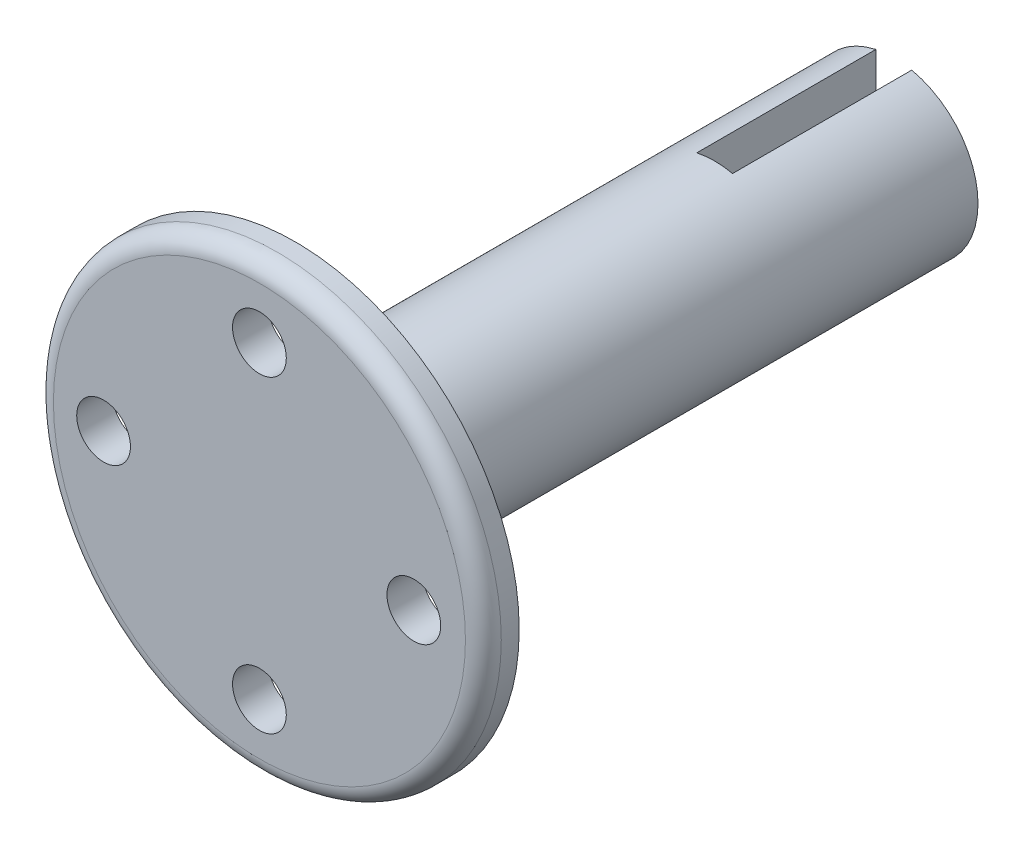
ISO-10303-21;
HEADER;
FILE_DESCRIPTION(('STEP AP214'),'2;1');
FILE_NAME('part.step','',(''),(''),'','','');
FILE_SCHEMA(('AUTOMOTIVE_DESIGN { 1 0 10303 214 1 1 1 1 }'));
ENDSEC;
DATA;
#1=APPLICATION_CONTEXT('core data for automotive mechanical design processes');
#2=APPLICATION_PROTOCOL_DEFINITION('international standard','automotive_design',2000,#1);
#3=PRODUCT_CONTEXT('',#1,'mechanical');
#4=PRODUCT('Part','Part','',(#3));
#5=PRODUCT_RELATED_PRODUCT_CATEGORY('part','',(#4));
#6=PRODUCT_DEFINITION_FORMATION('','',#4);
#7=PRODUCT_DEFINITION_CONTEXT('part definition',#1,'design');
#8=PRODUCT_DEFINITION('design','',#6,#7);
#9=PRODUCT_DEFINITION_SHAPE('','',#8);
#10=(LENGTH_UNIT() NAMED_UNIT(*) SI_UNIT(.MILLI.,.METRE.));
#11=(NAMED_UNIT(*) PLANE_ANGLE_UNIT() SI_UNIT($,.RADIAN.));
#12=(NAMED_UNIT(*) SI_UNIT($,.STERADIAN.) SOLID_ANGLE_UNIT());
#13=UNCERTAINTY_MEASURE_WITH_UNIT(LENGTH_MEASURE(1.E-05),#10,'distance_accuracy_value','');
#14=(GEOMETRIC_REPRESENTATION_CONTEXT(3) GLOBAL_UNCERTAINTY_ASSIGNED_CONTEXT((#13)) GLOBAL_UNIT_ASSIGNED_CONTEXT((#10,
#11,#12)) REPRESENTATION_CONTEXT('',''));
#15=CARTESIAN_POINT('',(0.,0.,0.));
#16=DIRECTION('',(0.,0.,1.));
#17=DIRECTION('',(1.,0.,0.));
#18=AXIS2_PLACEMENT_3D('',#15,#16,#17);
#19=CARTESIAN_POINT('',(0.,0.,2.));
#20=DIRECTION('',(0.,0.,-1.));
#21=DIRECTION('',(-1.,0.,0.));
#22=AXIS2_PLACEMENT_3D('',#19,#20,#21);
#23=CYLINDRICAL_SURFACE('',#22,12.5);
#24=CARTESIAN_POINT('',(0.,0.,1.));
#25=DIRECTION('',(0.,0.,1.));
#26=DIRECTION('',(1.,0.,0.));
#27=AXIS2_PLACEMENT_3D('',#24,#25,#26);
#28=CIRCLE('',#27,12.5);
#29=CARTESIAN_POINT('',(12.5,0.,1.));
#30=VERTEX_POINT('',#29);
#31=EDGE_CURVE('E47',#30,#30,#28,.F.);
#32=ORIENTED_EDGE('',*,*,#31,.T.);
#33=EDGE_LOOP('',(#32));
#34=FACE_BOUND('',#33,.T.);
#35=CARTESIAN_POINT('',(0.,0.,0.));
#36=DIRECTION('',(0.,0.,1.));
#37=DIRECTION('',(1.,0.,0.));
#38=AXIS2_PLACEMENT_3D('',#35,#36,#37);
#39=CIRCLE('',#38,12.5);
#40=CARTESIAN_POINT('',(12.5,0.,0.));
#41=VERTEX_POINT('',#40);
#42=EDGE_CURVE('E173',#41,#41,#39,.T.);
#43=ORIENTED_EDGE('',*,*,#42,.T.);
#44=EDGE_LOOP('',(#43));
#45=FACE_BOUND('',#44,.T.);
#46=ADVANCED_FACE('F38',(#34,#45),#23,.T.);
#47=CARTESIAN_POINT('',(0.,0.,2.));
#48=DIRECTION('',(0.,0.,1.));
#49=DIRECTION('',(1.,0.,0.));
#50=AXIS2_PLACEMENT_3D('',#47,#48,#49);
#51=PLANE('',#50);
#52=CARTESIAN_POINT('',(0.,8.62,2.));
#53=DIRECTION('',(0.,0.,1.));
#54=DIRECTION('',(1.,0.,0.));
#55=AXIS2_PLACEMENT_3D('',#52,#53,#54);
#56=CIRCLE('',#55,1.5);
#57=CARTESIAN_POINT('',(1.5,8.62,2.));
#58=VERTEX_POINT('',#57);
#59=EDGE_CURVE('E169',#58,#58,#56,.T.);
#60=ORIENTED_EDGE('',*,*,#59,.F.);
#61=EDGE_LOOP('',(#60));
#62=FACE_BOUND('',#61,.T.);
#63=CARTESIAN_POINT('',(8.62,0.,2.));
#64=DIRECTION('',(0.,0.,1.));
#65=DIRECTION('',(1.,0.,0.));
#66=AXIS2_PLACEMENT_3D('',#63,#64,#65);
#67=CIRCLE('',#66,1.5);
#68=CARTESIAN_POINT('',(10.12,0.,2.));
#69=VERTEX_POINT('',#68);
#70=EDGE_CURVE('E165',#69,#69,#67,.T.);
#71=ORIENTED_EDGE('',*,*,#70,.F.);
#72=EDGE_LOOP('',(#71));
#73=FACE_BOUND('',#72,.T.);
#74=CARTESIAN_POINT('',(-8.7,0.,2.));
#75=DIRECTION('',(0.,0.,1.));
#76=DIRECTION('',(1.,0.,0.));
#77=AXIS2_PLACEMENT_3D('',#74,#75,#76);
#78=CIRCLE('',#77,1.5);
#79=CARTESIAN_POINT('',(-7.2,0.,2.));
#80=VERTEX_POINT('',#79);
#81=EDGE_CURVE('E161',#80,#80,#78,.T.);
#82=ORIENTED_EDGE('',*,*,#81,.F.);
#83=EDGE_LOOP('',(#82));
#84=FACE_BOUND('',#83,.T.);
#85=CARTESIAN_POINT('',(0.,-8.62,2.));
#86=DIRECTION('',(0.,0.,1.));
#87=DIRECTION('',(1.,0.,0.));
#88=AXIS2_PLACEMENT_3D('',#85,#86,#87);
#89=CIRCLE('',#88,1.5);
#90=CARTESIAN_POINT('',(1.5,-8.62,2.));
#91=VERTEX_POINT('',#90);
#92=EDGE_CURVE('E146',#91,#91,#89,.T.);
#93=ORIENTED_EDGE('',*,*,#92,.F.);
#94=EDGE_LOOP('',(#93));
#95=FACE_BOUND('',#94,.T.);
#96=CARTESIAN_POINT('',(0.,0.,2.));
#97=DIRECTION('',(0.,0.,1.));
#98=DIRECTION('',(1.,0.,0.));
#99=AXIS2_PLACEMENT_3D('',#96,#97,#98);
#100=CIRCLE('',#99,11.5);
#101=CARTESIAN_POINT('',(11.5,0.,2.));
#102=VERTEX_POINT('',#101);
#103=EDGE_CURVE('E177',#102,#102,#100,.T.);
#104=ORIENTED_EDGE('',*,*,#103,.T.);
#105=EDGE_LOOP('',(#104));
#106=FACE_BOUND('',#105,.T.);
#107=ADVANCED_FACE('F192',(#62,#73,#84,#95,#106),#51,.T.);
#108=CARTESIAN_POINT('',(0.,0.,0.));
#109=DIRECTION('',(0.,0.,1.));
#110=DIRECTION('',(1.,0.,0.));
#111=AXIS2_PLACEMENT_3D('',#108,#109,#110);
#112=PLANE('',#111);
#113=CARTESIAN_POINT('',(0.,8.62,0.));
#114=DIRECTION('',(0.,0.,-1.));
#115=DIRECTION('',(-1.,0.,0.));
#116=AXIS2_PLACEMENT_3D('',#113,#114,#115);
#117=CIRCLE('',#116,1.5);
#118=CARTESIAN_POINT('',(-1.5,8.62,0.));
#119=VERTEX_POINT('',#118);
#120=EDGE_CURVE('E142',#119,#119,#117,.T.);
#121=ORIENTED_EDGE('',*,*,#120,.F.);
#122=EDGE_LOOP('',(#121));
#123=FACE_BOUND('',#122,.T.);
#124=CARTESIAN_POINT('',(8.62,0.,0.));
#125=DIRECTION('',(0.,0.,-1.));
#126=DIRECTION('',(-1.,0.,0.));
#127=AXIS2_PLACEMENT_3D('',#124,#125,#126);
#128=CIRCLE('',#127,1.5);
#129=CARTESIAN_POINT('',(7.12,0.,0.));
#130=VERTEX_POINT('',#129);
#131=EDGE_CURVE('E147',#130,#130,#128,.T.);
#132=ORIENTED_EDGE('',*,*,#131,.F.);
#133=EDGE_LOOP('',(#132));
#134=FACE_BOUND('',#133,.T.);
#135=CARTESIAN_POINT('',(-8.7,0.,0.));
#136=DIRECTION('',(0.,0.,-1.));
#137=DIRECTION('',(-1.,0.,0.));
#138=AXIS2_PLACEMENT_3D('',#135,#136,#137);
#139=CIRCLE('',#138,1.5);
#140=CARTESIAN_POINT('',(-10.2,0.,0.));
#141=VERTEX_POINT('',#140);
#142=EDGE_CURVE('E151',#141,#141,#139,.T.);
#143=ORIENTED_EDGE('',*,*,#142,.F.);
#144=EDGE_LOOP('',(#143));
#145=FACE_BOUND('',#144,.T.);
#146=CARTESIAN_POINT('',(0.,-8.62,0.));
#147=DIRECTION('',(0.,0.,-1.));
#148=DIRECTION('',(-1.,0.,0.));
#149=AXIS2_PLACEMENT_3D('',#146,#147,#148);
#150=CIRCLE('',#149,1.5);
#151=CARTESIAN_POINT('',(-1.5,-8.62,0.));
#152=VERTEX_POINT('',#151);
#153=EDGE_CURVE('E131',#152,#152,#150,.T.);
#154=ORIENTED_EDGE('',*,*,#153,.F.);
#155=EDGE_LOOP('',(#154));
#156=FACE_BOUND('',#155,.T.);
#157=ORIENTED_EDGE('',*,*,#42,.F.);
#158=EDGE_LOOP('',(#157));
#159=FACE_BOUND('',#158,.T.);
#160=CARTESIAN_POINT('',(0.,0.,0.));
#161=DIRECTION('',(0.,0.,1.));
#162=DIRECTION('',(1.,0.,0.));
#163=AXIS2_PLACEMENT_3D('',#160,#161,#162);
#164=CIRCLE('',#163,4.7);
#165=CARTESIAN_POINT('',(4.7,0.,0.));
#166=VERTEX_POINT('',#165);
#167=EDGE_CURVE('E98',#166,#166,#164,.F.);
#168=ORIENTED_EDGE('',*,*,#167,.F.);
#169=EDGE_LOOP('',(#168));
#170=FACE_BOUND('',#169,.T.);
#171=ADVANCED_FACE('F189',(#123,#134,#145,#156,#159,#170),#112,.F.);
#172=CARTESIAN_POINT('',(0.,0.,1.));
#173=DIRECTION('',(0.,0.,1.));
#174=DIRECTION('',(1.,0.,0.));
#175=AXIS2_PLACEMENT_3D('',#172,#173,#174);
#176=TOROIDAL_SURFACE('',#175,11.5,1.);
#177=ORIENTED_EDGE('',*,*,#31,.F.);
#178=EDGE_LOOP('',(#177));
#179=FACE_BOUND('',#178,.T.);
#180=ORIENTED_EDGE('',*,*,#103,.F.);
#181=EDGE_LOOP('',(#180));
#182=FACE_BOUND('',#181,.T.);
#183=ADVANCED_FACE('F40',(#179,#182),#176,.T.);
#184=CARTESIAN_POINT('',(0.,-8.62,23.41));
#185=DIRECTION('',(0.,0.,-1.));
#186=DIRECTION('',(-1.,0.,0.));
#187=AXIS2_PLACEMENT_3D('',#184,#185,#186);
#188=CYLINDRICAL_SURFACE('',#187,1.5);
#189=ORIENTED_EDGE('',*,*,#92,.T.);
#190=EDGE_LOOP('',(#189));
#191=FACE_BOUND('',#190,.T.);
#192=ORIENTED_EDGE('',*,*,#153,.T.);
#193=EDGE_LOOP('',(#192));
#194=FACE_BOUND('',#193,.T.);
#195=ADVANCED_FACE('F188',(#191,#194),#188,.F.);
#196=CARTESIAN_POINT('',(-8.7,0.,23.41));
#197=DIRECTION('',(0.,0.,-1.));
#198=DIRECTION('',(-1.,0.,0.));
#199=AXIS2_PLACEMENT_3D('',#196,#197,#198);
#200=CYLINDRICAL_SURFACE('',#199,1.5);
#201=ORIENTED_EDGE('',*,*,#81,.T.);
#202=EDGE_LOOP('',(#201));
#203=FACE_BOUND('',#202,.T.);
#204=ORIENTED_EDGE('',*,*,#142,.T.);
#205=EDGE_LOOP('',(#204));
#206=FACE_BOUND('',#205,.T.);
#207=ADVANCED_FACE('F210',(#203,#206),#200,.F.);
#208=CARTESIAN_POINT('',(8.62,0.,23.41));
#209=DIRECTION('',(0.,0.,-1.));
#210=DIRECTION('',(-1.,0.,0.));
#211=AXIS2_PLACEMENT_3D('',#208,#209,#210);
#212=CYLINDRICAL_SURFACE('',#211,1.5);
#213=ORIENTED_EDGE('',*,*,#70,.T.);
#214=EDGE_LOOP('',(#213));
#215=FACE_BOUND('',#214,.T.);
#216=ORIENTED_EDGE('',*,*,#131,.T.);
#217=EDGE_LOOP('',(#216));
#218=FACE_BOUND('',#217,.T.);
#219=ADVANCED_FACE('F214',(#215,#218),#212,.F.);
#220=CARTESIAN_POINT('',(0.,8.62,23.41));
#221=DIRECTION('',(0.,0.,-1.));
#222=DIRECTION('',(-1.,0.,0.));
#223=AXIS2_PLACEMENT_3D('',#220,#221,#222);
#224=CYLINDRICAL_SURFACE('',#223,1.5);
#225=ORIENTED_EDGE('',*,*,#59,.T.);
#226=EDGE_LOOP('',(#225));
#227=FACE_BOUND('',#226,.T.);
#228=ORIENTED_EDGE('',*,*,#120,.T.);
#229=EDGE_LOOP('',(#228));
#230=FACE_BOUND('',#229,.T.);
#231=ADVANCED_FACE('F218',(#227,#230),#224,.F.);
#232=CARTESIAN_POINT('',(0.,0.,14.142135623731));
#233=DIRECTION('',(0.,0.,-1.));
#234=DIRECTION('',(-1.,0.,0.));
#235=AXIS2_PLACEMENT_3D('',#232,#233,#234);
#236=CYLINDRICAL_SURFACE('',#235,4.7);
#237=ORIENTED_EDGE('',*,*,#167,.T.);
#238=EDGE_LOOP('',(#237));
#239=FACE_BOUND('',#238,.T.);
#240=DIRECTION('',(0.,0.,-1.));
#241=VECTOR('',#240,1.);
#242=CARTESIAN_POINT('',(1.,4.59238500128201,14.142135623731));
#243=LINE('',#242,#241);
#244=CARTESIAN_POINT('',(1.,4.59238500128201,-33.41));
#245=VERTEX_POINT('',#244);
#246=CARTESIAN_POINT('',(1.,4.59238500128201,-23.41));
#247=VERTEX_POINT('',#246);
#248=EDGE_CURVE('E54',#245,#247,#243,.F.);
#249=ORIENTED_EDGE('',*,*,#248,.T.);
#250=CARTESIAN_POINT('',(0.,0.,-23.41));
#251=DIRECTION('',(0.,0.,-1.));
#252=DIRECTION('',(-1.,0.,0.));
#253=AXIS2_PLACEMENT_3D('',#250,#251,#252);
#254=CIRCLE('',#253,4.7);
#255=CARTESIAN_POINT('',(-1.,4.59238500128201,-23.41));
#256=VERTEX_POINT('',#255);
#257=EDGE_CURVE('E11',#256,#247,#254,.T.);
#258=ORIENTED_EDGE('',*,*,#257,.F.);
#259=DIRECTION('',(0.,0.,-1.));
#260=VECTOR('',#259,1.);
#261=CARTESIAN_POINT('',(-1.,4.59238500128201,14.142135623731));
#262=LINE('',#261,#260);
#263=CARTESIAN_POINT('',(-1.,4.59238500128201,-33.41));
#264=VERTEX_POINT('',#263);
#265=EDGE_CURVE('E89',#256,#264,#262,.T.);
#266=ORIENTED_EDGE('',*,*,#265,.T.);
#267=CARTESIAN_POINT('',(0.,0.,-33.41));
#268=DIRECTION('',(0.,0.,-1.));
#269=DIRECTION('',(-1.,0.,0.));
#270=AXIS2_PLACEMENT_3D('',#267,#268,#269);
#271=CIRCLE('',#270,4.7);
#272=EDGE_CURVE('E92',#245,#264,#271,.T.);
#273=ORIENTED_EDGE('',*,*,#272,.F.);
#274=EDGE_LOOP('',(#249,#258,#266,#273));
#275=FACE_BOUND('',#274,.T.);
#276=ADVANCED_FACE('F91',(#239,#275),#236,.T.);
#277=CARTESIAN_POINT('',(0.,0.,-23.41));
#278=DIRECTION('',(0.,0.,-1.));
#279=DIRECTION('',(-1.,0.,0.));
#280=AXIS2_PLACEMENT_3D('',#277,#278,#279);
#281=CYLINDRICAL_SURFACE('',#280,2.);
#282=CARTESIAN_POINT('',(0.,0.,-33.41));
#283=DIRECTION('',(0.,0.,-1.));
#284=DIRECTION('',(-1.,0.,0.));
#285=AXIS2_PLACEMENT_3D('',#282,#283,#284);
#286=CIRCLE('',#285,2.);
#287=CARTESIAN_POINT('',(-1.5,1.3228756555323,-33.41));
#288=VERTEX_POINT('',#287);
#289=CARTESIAN_POINT('',(-1.,1.73205080756888,-33.41));
#290=VERTEX_POINT('',#289);
#291=EDGE_CURVE('E61',#288,#290,#286,.T.);
#292=ORIENTED_EDGE('',*,*,#291,.T.);
#293=DIRECTION('',(0.,0.,-1.));
#294=VECTOR('',#293,1.);
#295=CARTESIAN_POINT('',(-1.,1.73205080756888,-23.41));
#296=LINE('',#295,#294);
#297=CARTESIAN_POINT('',(-1.,1.73205080756888,-23.41));
#298=VERTEX_POINT('',#297);
#299=EDGE_CURVE('E110',#298,#290,#296,.T.);
#300=ORIENTED_EDGE('',*,*,#299,.F.);
#301=CARTESIAN_POINT('',(0.,0.,-23.41));
#302=DIRECTION('',(0.,0.,-1.));
#303=DIRECTION('',(-1.,0.,0.));
#304=AXIS2_PLACEMENT_3D('',#301,#302,#303);
#305=CIRCLE('',#304,2.);
#306=CARTESIAN_POINT('',(-1.5,1.3228756555323,-23.41));
#307=VERTEX_POINT('',#306);
#308=EDGE_CURVE('E127',#307,#298,#305,.T.);
#309=ORIENTED_EDGE('',*,*,#308,.F.);
#310=DIRECTION('',(0.,0.,-1.));
#311=VECTOR('',#310,1.);
#312=CARTESIAN_POINT('',(-1.5,1.3228756555323,-23.41));
#313=LINE('',#312,#311);
#314=EDGE_CURVE('E128',#307,#288,#313,.T.);
#315=ORIENTED_EDGE('',*,*,#314,.T.);
#316=EDGE_LOOP('',(#292,#300,#309,#315));
#317=FACE_BOUND('',#316,.T.);
#318=ADVANCED_FACE('F223',(#317),#281,.F.);
#319=CARTESIAN_POINT('',(-1.5,1.3228756555323,-23.41));
#320=DIRECTION('',(-1.,0.,0.));
#321=DIRECTION('',(0.,0.,1.));
#322=AXIS2_PLACEMENT_3D('',#319,#320,#321);
#323=PLANE('',#322);
#324=DIRECTION('',(0.,1.,0.));
#325=VECTOR('',#324,1.);
#326=CARTESIAN_POINT('',(-1.5,1.3228756555323,-33.41));
#327=LINE('',#326,#325);
#328=CARTESIAN_POINT('',(-1.5,-1.32287565553229,-33.41));
#329=VERTEX_POINT('',#328);
#330=EDGE_CURVE('E123',#329,#288,#327,.T.);
#331=ORIENTED_EDGE('',*,*,#330,.T.);
#332=ORIENTED_EDGE('',*,*,#314,.F.);
#333=DIRECTION('',(0.,1.,0.));
#334=VECTOR('',#333,1.);
#335=CARTESIAN_POINT('',(-1.5,1.3228756555323,-23.41));
#336=LINE('',#335,#334);
#337=CARTESIAN_POINT('',(-1.5,-1.32287565553229,-23.41));
#338=VERTEX_POINT('',#337);
#339=EDGE_CURVE('E141',#338,#307,#336,.T.);
#340=ORIENTED_EDGE('',*,*,#339,.F.);
#341=DIRECTION('',(0.,0.,-1.));
#342=VECTOR('',#341,1.);
#343=CARTESIAN_POINT('',(-1.5,-1.32287565553229,-23.41));
#344=LINE('',#343,#342);
#345=EDGE_CURVE('E132',#338,#329,#344,.T.);
#346=ORIENTED_EDGE('',*,*,#345,.T.);
#347=EDGE_LOOP('',(#331,#332,#340,#346));
#348=FACE_BOUND('',#347,.T.);
#349=ADVANCED_FACE('F226',(#348),#323,.F.);
#350=CARTESIAN_POINT('',(0.,0.,-23.41));
#351=DIRECTION('',(0.,0.,-1.));
#352=DIRECTION('',(-1.,0.,0.));
#353=AXIS2_PLACEMENT_3D('',#350,#351,#352);
#354=CYLINDRICAL_SURFACE('',#353,2.);
#355=CARTESIAN_POINT('',(0.,0.,-33.41));
#356=DIRECTION('',(0.,0.,-1.));
#357=DIRECTION('',(-1.,0.,0.));
#358=AXIS2_PLACEMENT_3D('',#355,#356,#357);
#359=CIRCLE('',#358,2.);
#360=CARTESIAN_POINT('',(1.,1.73205080756888,-33.41));
#361=VERTEX_POINT('',#360);
#362=EDGE_CURVE('E115',#361,#329,#359,.T.);
#363=ORIENTED_EDGE('',*,*,#362,.T.);
#364=ORIENTED_EDGE('',*,*,#345,.F.);
#365=CARTESIAN_POINT('',(0.,0.,-23.41));
#366=DIRECTION('',(0.,0.,-1.));
#367=DIRECTION('',(-1.,0.,0.));
#368=AXIS2_PLACEMENT_3D('',#365,#366,#367);
#369=CIRCLE('',#368,2.);
#370=CARTESIAN_POINT('',(1.,1.73205080756888,-23.41));
#371=VERTEX_POINT('',#370);
#372=EDGE_CURVE('E264',#371,#338,#369,.T.);
#373=ORIENTED_EDGE('',*,*,#372,.F.);
#374=DIRECTION('',(0.,0.,-1.));
#375=VECTOR('',#374,1.);
#376=CARTESIAN_POINT('',(1.,1.73205080756888,-23.41));
#377=LINE('',#376,#375);
#378=EDGE_CURVE('E135',#371,#361,#377,.T.);
#379=ORIENTED_EDGE('',*,*,#378,.T.);
#380=EDGE_LOOP('',(#363,#364,#373,#379));
#381=FACE_BOUND('',#380,.T.);
#382=ADVANCED_FACE('F233',(#381),#354,.F.);
#383=CARTESIAN_POINT('',(0.,0.,-23.41));
#384=DIRECTION('',(0.,0.,-1.));
#385=DIRECTION('',(-1.,0.,0.));
#386=AXIS2_PLACEMENT_3D('',#383,#384,#385);
#387=PLANE('',#386);
#388=DIRECTION('',(0.,1.,0.));
#389=VECTOR('',#388,1.);
#390=CARTESIAN_POINT('',(-1.,4.89897948556636,-23.41));
#391=LINE('',#390,#389);
#392=EDGE_CURVE('E258',#298,#256,#391,.T.);
#393=ORIENTED_EDGE('',*,*,#392,.T.);
#394=ORIENTED_EDGE('',*,*,#257,.T.);
#395=DIRECTION('',(0.,-1.,0.));
#396=VECTOR('',#395,1.);
#397=CARTESIAN_POINT('',(1.,4.89897948556636,-23.41));
#398=LINE('',#397,#396);
#399=EDGE_CURVE('E261',#247,#371,#398,.T.);
#400=ORIENTED_EDGE('',*,*,#399,.T.);
#401=ORIENTED_EDGE('',*,*,#372,.T.);
#402=ORIENTED_EDGE('',*,*,#339,.T.);
#403=ORIENTED_EDGE('',*,*,#308,.T.);
#404=EDGE_LOOP('',(#393,#394,#400,#401,#402,#403));
#405=FACE_BOUND('',#404,.T.);
#406=ADVANCED_FACE('F229',(#405),#387,.T.);
#407=CARTESIAN_POINT('',(-1.,4.89897948556636,-23.41));
#408=DIRECTION('',(-1.,0.,0.));
#409=DIRECTION('',(0.,-1.,0.));
#410=AXIS2_PLACEMENT_3D('',#407,#408,#409);
#411=PLANE('',#410);
#412=ORIENTED_EDGE('',*,*,#265,.F.);
#413=ORIENTED_EDGE('',*,*,#392,.F.);
#414=ORIENTED_EDGE('',*,*,#299,.T.);
#415=DIRECTION('',(0.,1.,0.));
#416=VECTOR('',#415,1.);
#417=CARTESIAN_POINT('',(-1.,4.89897948556636,-33.41));
#418=LINE('',#417,#416);
#419=EDGE_CURVE('E104',#290,#264,#418,.T.);
#420=ORIENTED_EDGE('',*,*,#419,.T.);
#421=EDGE_LOOP('',(#412,#413,#414,#420));
#422=FACE_BOUND('',#421,.T.);
#423=ADVANCED_FACE('F109',(#422),#411,.F.);
#424=CARTESIAN_POINT('',(1.,4.89897948556636,-23.41));
#425=DIRECTION('',(1.,0.,0.));
#426=DIRECTION('',(0.,1.,0.));
#427=AXIS2_PLACEMENT_3D('',#424,#425,#426);
#428=PLANE('',#427);
#429=ORIENTED_EDGE('',*,*,#248,.F.);
#430=DIRECTION('',(0.,-1.,0.));
#431=VECTOR('',#430,1.);
#432=CARTESIAN_POINT('',(1.,4.89897948556636,-33.41));
#433=LINE('',#432,#431);
#434=EDGE_CURVE('E106',#245,#361,#433,.T.);
#435=ORIENTED_EDGE('',*,*,#434,.T.);
#436=ORIENTED_EDGE('',*,*,#378,.F.);
#437=ORIENTED_EDGE('',*,*,#399,.F.);
#438=EDGE_LOOP('',(#429,#435,#436,#437));
#439=FACE_BOUND('',#438,.T.);
#440=ADVANCED_FACE('F207',(#439),#428,.F.);
#441=CARTESIAN_POINT('',(0.,0.,-33.41));
#442=DIRECTION('',(0.,0.,-1.));
#443=DIRECTION('',(-1.,0.,0.));
#444=AXIS2_PLACEMENT_3D('',#441,#442,#443);
#445=PLANE('',#444);
#446=ORIENTED_EDGE('',*,*,#434,.F.);
#447=ORIENTED_EDGE('',*,*,#272,.T.);
#448=ORIENTED_EDGE('',*,*,#419,.F.);
#449=ORIENTED_EDGE('',*,*,#291,.F.);
#450=ORIENTED_EDGE('',*,*,#330,.F.);
#451=ORIENTED_EDGE('',*,*,#362,.F.);
#452=EDGE_LOOP('',(#446,#447,#448,#449,#450,#451));
#453=FACE_BOUND('',#452,.T.);
#454=ADVANCED_FACE('F103',(#453),#445,.T.);
#455=CLOSED_SHELL('',(#46,#107,#171,#183,#195,#207,#219,#231,#276,#318,#349,#382,#406,#423,#440,#454));
#456=MANIFOLD_SOLID_BREP('B2',#455);
#457=ADVANCED_BREP_SHAPE_REPRESENTATION('',(#18,#456),#14);
#458=SHAPE_DEFINITION_REPRESENTATION(#9,#457);
ENDSEC;
END-ISO-10303-21;
